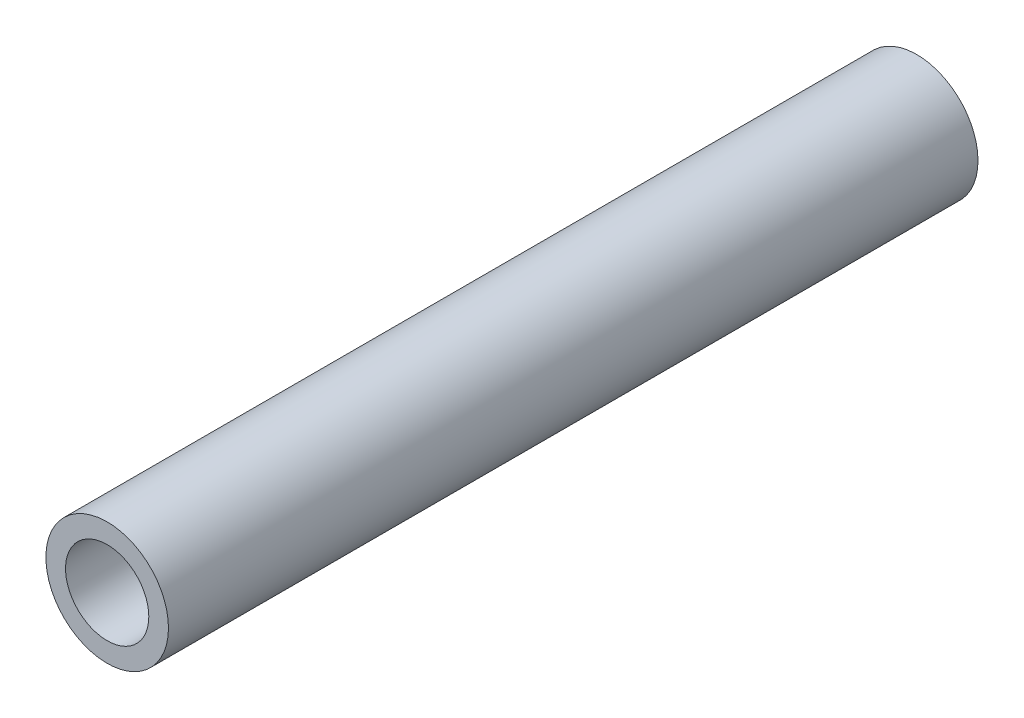
ISO-10303-21;
HEADER;
FILE_DESCRIPTION(('STEP AP214'),'2;1');
FILE_NAME('part.step','',(''),(''),'','','');
FILE_SCHEMA(('AUTOMOTIVE_DESIGN { 1 0 10303 214 1 1 1 1 }'));
ENDSEC;
DATA;
#1=APPLICATION_CONTEXT('core data for automotive mechanical design processes');
#2=APPLICATION_PROTOCOL_DEFINITION('international standard','automotive_design',2000,#1);
#3=PRODUCT_CONTEXT('',#1,'mechanical');
#4=PRODUCT('Part','Part','',(#3));
#5=PRODUCT_RELATED_PRODUCT_CATEGORY('part','',(#4));
#6=PRODUCT_DEFINITION_FORMATION('','',#4);
#7=PRODUCT_DEFINITION_CONTEXT('part definition',#1,'design');
#8=PRODUCT_DEFINITION('design','',#6,#7);
#9=PRODUCT_DEFINITION_SHAPE('','',#8);
#10=(LENGTH_UNIT() NAMED_UNIT(*) SI_UNIT(.MILLI.,.METRE.));
#11=(NAMED_UNIT(*) PLANE_ANGLE_UNIT() SI_UNIT($,.RADIAN.));
#12=(NAMED_UNIT(*) SI_UNIT($,.STERADIAN.) SOLID_ANGLE_UNIT());
#13=UNCERTAINTY_MEASURE_WITH_UNIT(LENGTH_MEASURE(1.E-05),#10,'distance_accuracy_value','');
#14=(GEOMETRIC_REPRESENTATION_CONTEXT(3) GLOBAL_UNCERTAINTY_ASSIGNED_CONTEXT((#13)) GLOBAL_UNIT_ASSIGNED_CONTEXT((#10,
#11,#12)) REPRESENTATION_CONTEXT('',''));
#15=CARTESIAN_POINT('',(0.,0.,0.));
#16=DIRECTION('',(0.,0.,1.));
#17=DIRECTION('',(1.,0.,0.));
#18=AXIS2_PLACEMENT_3D('',#15,#16,#17);
#19=CARTESIAN_POINT('',(0.,0.,35.));
#20=DIRECTION('',(0.,0.,1.));
#21=DIRECTION('',(1.,0.,0.));
#22=AXIS2_PLACEMENT_3D('',#19,#20,#21);
#23=PLANE('',#22);
#24=CARTESIAN_POINT('',(0.,0.,35.));
#25=DIRECTION('',(0.,0.,1.));
#26=DIRECTION('',(1.,0.,0.));
#27=AXIS2_PLACEMENT_3D('',#24,#25,#26);
#28=CIRCLE('',#27,2.65);
#29=CARTESIAN_POINT('',(2.65,0.,35.));
#30=VERTEX_POINT('',#29);
#31=EDGE_CURVE('E10',#30,#30,#28,.T.);
#32=ORIENTED_EDGE('',*,*,#31,.T.);
#33=EDGE_LOOP('',(#32));
#34=FACE_BOUND('',#33,.T.);
#35=CARTESIAN_POINT('',(0.,0.,35.));
#36=DIRECTION('',(0.,0.,1.));
#37=DIRECTION('',(1.,0.,0.));
#38=AXIS2_PLACEMENT_3D('',#35,#36,#37);
#39=CIRCLE('',#38,1.8);
#40=CARTESIAN_POINT('',(1.8,0.,35.));
#41=VERTEX_POINT('',#40);
#42=EDGE_CURVE('E50',#41,#41,#39,.T.);
#43=ORIENTED_EDGE('',*,*,#42,.F.);
#44=EDGE_LOOP('',(#43));
#45=FACE_BOUND('',#44,.T.);
#46=ADVANCED_FACE('F37',(#34,#45),#23,.T.);
#47=CARTESIAN_POINT('',(0.,0.,0.));
#48=DIRECTION('',(0.,0.,1.));
#49=DIRECTION('',(1.,0.,0.));
#50=AXIS2_PLACEMENT_3D('',#47,#48,#49);
#51=PLANE('',#50);
#52=CARTESIAN_POINT('',(0.,0.,0.));
#53=DIRECTION('',(0.,0.,1.));
#54=DIRECTION('',(1.,0.,0.));
#55=AXIS2_PLACEMENT_3D('',#52,#53,#54);
#56=CIRCLE('',#55,2.65);
#57=CARTESIAN_POINT('',(2.65,0.,0.));
#58=VERTEX_POINT('',#57);
#59=EDGE_CURVE('E41',#58,#58,#56,.T.);
#60=ORIENTED_EDGE('',*,*,#59,.F.);
#61=EDGE_LOOP('',(#60));
#62=FACE_BOUND('',#61,.T.);
#63=CARTESIAN_POINT('',(0.,0.,0.));
#64=DIRECTION('',(0.,0.,1.));
#65=DIRECTION('',(1.,0.,0.));
#66=AXIS2_PLACEMENT_3D('',#63,#64,#65);
#67=CIRCLE('',#66,1.8);
#68=CARTESIAN_POINT('',(1.8,0.,0.));
#69=VERTEX_POINT('',#68);
#70=EDGE_CURVE('E52',#69,#69,#67,.T.);
#71=ORIENTED_EDGE('',*,*,#70,.T.);
#72=EDGE_LOOP('',(#71));
#73=FACE_BOUND('',#72,.T.);
#74=ADVANCED_FACE('F64',(#62,#73),#51,.F.);
#75=CARTESIAN_POINT('',(0.,0.,35.));
#76=DIRECTION('',(0.,0.,-1.));
#77=DIRECTION('',(-1.,0.,0.));
#78=AXIS2_PLACEMENT_3D('',#75,#76,#77);
#79=CYLINDRICAL_SURFACE('',#78,2.65);
#80=ORIENTED_EDGE('',*,*,#31,.F.);
#81=EDGE_LOOP('',(#80));
#82=FACE_BOUND('',#81,.T.);
#83=ORIENTED_EDGE('',*,*,#59,.T.);
#84=EDGE_LOOP('',(#83));
#85=FACE_BOUND('',#84,.T.);
#86=ADVANCED_FACE('F39',(#82,#85),#79,.T.);
#87=CARTESIAN_POINT('',(0.,0.,35.));
#88=DIRECTION('',(0.,0.,-1.));
#89=DIRECTION('',(-1.,0.,0.));
#90=AXIS2_PLACEMENT_3D('',#87,#88,#89);
#91=CYLINDRICAL_SURFACE('',#90,1.8);
#92=ORIENTED_EDGE('',*,*,#42,.T.);
#93=EDGE_LOOP('',(#92));
#94=FACE_BOUND('',#93,.T.);
#95=ORIENTED_EDGE('',*,*,#70,.F.);
#96=EDGE_LOOP('',(#95));
#97=FACE_BOUND('',#96,.T.);
#98=ADVANCED_FACE('F60',(#94,#97),#91,.F.);
#99=CLOSED_SHELL('',(#46,#74,#86,#98));
#100=MANIFOLD_SOLID_BREP('B2',#99);
#101=ADVANCED_BREP_SHAPE_REPRESENTATION('',(#18,#100),#14);
#102=SHAPE_DEFINITION_REPRESENTATION(#9,#101);
ENDSEC;
END-ISO-10303-21;
